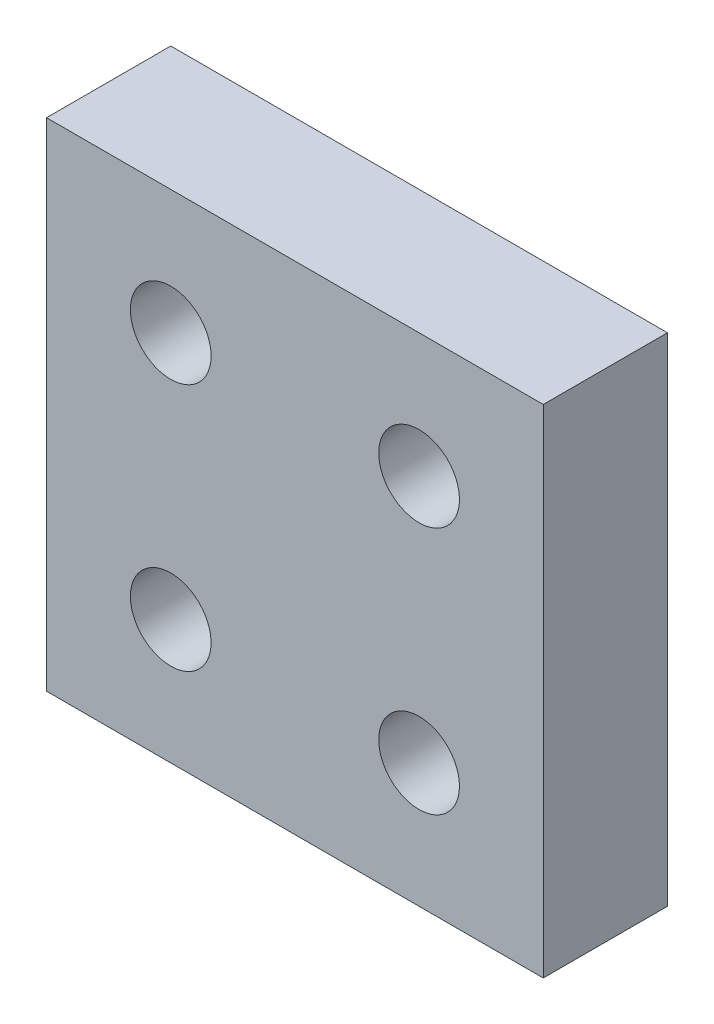
ISO-10303-21;
HEADER;
FILE_DESCRIPTION(('STEP AP214'),'2;1');
FILE_NAME('part.step','',(''),(''),'','','');
FILE_SCHEMA(('AUTOMOTIVE_DESIGN { 1 0 10303 214 1 1 1 1 }'));
ENDSEC;
DATA;
#1=APPLICATION_CONTEXT('core data for automotive mechanical design processes');
#2=APPLICATION_PROTOCOL_DEFINITION('international standard','automotive_design',2000,#1);
#3=PRODUCT_CONTEXT('',#1,'mechanical');
#4=PRODUCT('Part','Part','',(#3));
#5=PRODUCT_RELATED_PRODUCT_CATEGORY('part','',(#4));
#6=PRODUCT_DEFINITION_FORMATION('','',#4);
#7=PRODUCT_DEFINITION_CONTEXT('part definition',#1,'design');
#8=PRODUCT_DEFINITION('design','',#6,#7);
#9=PRODUCT_DEFINITION_SHAPE('','',#8);
#10=(LENGTH_UNIT() NAMED_UNIT(*) SI_UNIT(.MILLI.,.METRE.));
#11=(NAMED_UNIT(*) PLANE_ANGLE_UNIT() SI_UNIT($,.RADIAN.));
#12=(NAMED_UNIT(*) SI_UNIT($,.STERADIAN.) SOLID_ANGLE_UNIT());
#13=UNCERTAINTY_MEASURE_WITH_UNIT(LENGTH_MEASURE(1.E-05),#10,'distance_accuracy_value','');
#14=(GEOMETRIC_REPRESENTATION_CONTEXT(3) GLOBAL_UNCERTAINTY_ASSIGNED_CONTEXT((#13)) GLOBAL_UNIT_ASSIGNED_CONTEXT((#10,
#11,#12)) REPRESENTATION_CONTEXT('',''));
#15=CARTESIAN_POINT('',(0.,0.,0.));
#16=DIRECTION('',(0.,0.,1.));
#17=DIRECTION('',(1.,0.,0.));
#18=AXIS2_PLACEMENT_3D('',#15,#16,#17);
#19=CARTESIAN_POINT('',(0.,0.,5.));
#20=DIRECTION('',(1.,0.,0.));
#21=DIRECTION('',(0.,1.,0.));
#22=AXIS2_PLACEMENT_3D('',#19,#20,#21);
#23=PLANE('',#22);
#24=DIRECTION('',(0.,-1.,0.));
#25=VECTOR('',#24,1.);
#26=CARTESIAN_POINT('',(0.,0.,0.));
#27=LINE('',#26,#25);
#28=CARTESIAN_POINT('',(0.,0.,0.));
#29=VERTEX_POINT('',#28);
#30=CARTESIAN_POINT('',(0.,-20.,0.));
#31=VERTEX_POINT('',#30);
#32=EDGE_CURVE('E111',#29,#31,#27,.T.);
#33=ORIENTED_EDGE('',*,*,#32,.T.);
#34=DIRECTION('',(0.,0.,-1.));
#35=VECTOR('',#34,1.);
#36=CARTESIAN_POINT('',(0.,-20.,5.));
#37=LINE('',#36,#35);
#38=CARTESIAN_POINT('',(0.,-20.,5.));
#39=VERTEX_POINT('',#38);
#40=EDGE_CURVE('E11',#39,#31,#37,.T.);
#41=ORIENTED_EDGE('',*,*,#40,.F.);
#42=DIRECTION('',(0.,-1.,0.));
#43=VECTOR('',#42,1.);
#44=CARTESIAN_POINT('',(0.,0.,5.));
#45=LINE('',#44,#43);
#46=CARTESIAN_POINT('',(0.,0.,5.));
#47=VERTEX_POINT('',#46);
#48=EDGE_CURVE('E95',#47,#39,#45,.T.);
#49=ORIENTED_EDGE('',*,*,#48,.F.);
#50=DIRECTION('',(0.,0.,-1.));
#51=VECTOR('',#50,1.);
#52=CARTESIAN_POINT('',(0.,0.,5.));
#53=LINE('',#52,#51);
#54=EDGE_CURVE('E107',#47,#29,#53,.T.);
#55=ORIENTED_EDGE('',*,*,#54,.T.);
#56=EDGE_LOOP('',(#33,#41,#49,#55));
#57=FACE_BOUND('',#56,.T.);
#58=ADVANCED_FACE('F43',(#57),#23,.F.);
#59=CARTESIAN_POINT('',(0.,-20.,5.));
#60=DIRECTION('',(0.,1.,0.));
#61=DIRECTION('',(0.,0.,1.));
#62=AXIS2_PLACEMENT_3D('',#59,#60,#61);
#63=PLANE('',#62);
#64=DIRECTION('',(1.,0.,0.));
#65=VECTOR('',#64,1.);
#66=CARTESIAN_POINT('',(0.,-20.,0.));
#67=LINE('',#66,#65);
#68=CARTESIAN_POINT('',(20.,-20.,0.));
#69=VERTEX_POINT('',#68);
#70=EDGE_CURVE('E100',#31,#69,#67,.T.);
#71=ORIENTED_EDGE('',*,*,#70,.T.);
#72=DIRECTION('',(0.,0.,-1.));
#73=VECTOR('',#72,1.);
#74=CARTESIAN_POINT('',(20.,-20.,5.));
#75=LINE('',#74,#73);
#76=CARTESIAN_POINT('',(20.,-20.,5.));
#77=VERTEX_POINT('',#76);
#78=EDGE_CURVE('E52',#77,#69,#75,.T.);
#79=ORIENTED_EDGE('',*,*,#78,.F.);
#80=DIRECTION('',(1.,0.,0.));
#81=VECTOR('',#80,1.);
#82=CARTESIAN_POINT('',(0.,-20.,5.));
#83=LINE('',#82,#81);
#84=EDGE_CURVE('E90',#39,#77,#83,.T.);
#85=ORIENTED_EDGE('',*,*,#84,.F.);
#86=ORIENTED_EDGE('',*,*,#40,.T.);
#87=EDGE_LOOP('',(#71,#79,#85,#86));
#88=FACE_BOUND('',#87,.T.);
#89=ADVANCED_FACE('F99',(#88),#63,.F.);
#90=CARTESIAN_POINT('',(20.,0.,5.));
#91=DIRECTION('',(-1.,0.,0.));
#92=DIRECTION('',(0.,-1.,0.));
#93=AXIS2_PLACEMENT_3D('',#90,#91,#92);
#94=PLANE('',#93);
#95=DIRECTION('',(0.,1.,0.));
#96=VECTOR('',#95,1.);
#97=CARTESIAN_POINT('',(20.,0.,0.));
#98=LINE('',#97,#96);
#99=CARTESIAN_POINT('',(20.,0.,0.));
#100=VERTEX_POINT('',#99);
#101=EDGE_CURVE('E77',#69,#100,#98,.T.);
#102=ORIENTED_EDGE('',*,*,#101,.T.);
#103=DIRECTION('',(0.,0.,-1.));
#104=VECTOR('',#103,1.);
#105=CARTESIAN_POINT('',(20.,0.,5.));
#106=LINE('',#105,#104);
#107=CARTESIAN_POINT('',(20.,0.,5.));
#108=VERTEX_POINT('',#107);
#109=EDGE_CURVE('E102',#108,#100,#106,.T.);
#110=ORIENTED_EDGE('',*,*,#109,.F.);
#111=DIRECTION('',(0.,1.,0.));
#112=VECTOR('',#111,1.);
#113=CARTESIAN_POINT('',(20.,0.,5.));
#114=LINE('',#113,#112);
#115=EDGE_CURVE('E93',#77,#108,#114,.T.);
#116=ORIENTED_EDGE('',*,*,#115,.F.);
#117=ORIENTED_EDGE('',*,*,#78,.T.);
#118=EDGE_LOOP('',(#102,#110,#116,#117));
#119=FACE_BOUND('',#118,.T.);
#120=ADVANCED_FACE('F103',(#119),#94,.F.);
#121=CARTESIAN_POINT('',(0.,0.,5.));
#122=DIRECTION('',(0.,-1.,0.));
#123=DIRECTION('',(0.,0.,-1.));
#124=AXIS2_PLACEMENT_3D('',#121,#122,#123);
#125=PLANE('',#124);
#126=DIRECTION('',(-1.,0.,0.));
#127=VECTOR('',#126,1.);
#128=CARTESIAN_POINT('',(0.,0.,0.));
#129=LINE('',#128,#127);
#130=EDGE_CURVE('E83',#100,#29,#129,.T.);
#131=ORIENTED_EDGE('',*,*,#130,.T.);
#132=ORIENTED_EDGE('',*,*,#54,.F.);
#133=DIRECTION('',(-1.,0.,0.));
#134=VECTOR('',#133,1.);
#135=CARTESIAN_POINT('',(0.,0.,5.));
#136=LINE('',#135,#134);
#137=EDGE_CURVE('E60',#108,#47,#136,.T.);
#138=ORIENTED_EDGE('',*,*,#137,.F.);
#139=ORIENTED_EDGE('',*,*,#109,.T.);
#140=EDGE_LOOP('',(#131,#132,#138,#139));
#141=FACE_BOUND('',#140,.T.);
#142=ADVANCED_FACE('F125',(#141),#125,.F.);
#143=CARTESIAN_POINT('',(0.,0.,5.));
#144=DIRECTION('',(0.,0.,1.));
#145=DIRECTION('',(1.,0.,0.));
#146=AXIS2_PLACEMENT_3D('',#143,#144,#145);
#147=PLANE('',#146);
#148=CARTESIAN_POINT('',(5.,-15.,5.));
#149=DIRECTION('',(0.,0.,1.));
#150=DIRECTION('',(-1.,0.,0.));
#151=AXIS2_PLACEMENT_3D('',#148,#149,#150);
#152=CIRCLE('',#151,1.625);
#153=CARTESIAN_POINT('',(3.375,-15.,5.));
#154=VERTEX_POINT('',#153);
#155=EDGE_CURVE('E144',#154,#154,#152,.T.);
#156=ORIENTED_EDGE('',*,*,#155,.F.);
#157=EDGE_LOOP('',(#156));
#158=FACE_BOUND('',#157,.T.);
#159=CARTESIAN_POINT('',(15.,-15.,5.));
#160=DIRECTION('',(0.,0.,1.));
#161=DIRECTION('',(1.,0.,0.));
#162=AXIS2_PLACEMENT_3D('',#159,#160,#161);
#163=CIRCLE('',#162,1.625);
#164=CARTESIAN_POINT('',(16.625,-15.,5.));
#165=VERTEX_POINT('',#164);
#166=EDGE_CURVE('E152',#165,#165,#163,.T.);
#167=ORIENTED_EDGE('',*,*,#166,.F.);
#168=EDGE_LOOP('',(#167));
#169=FACE_BOUND('',#168,.T.);
#170=CARTESIAN_POINT('',(15.,-5.,5.));
#171=DIRECTION('',(0.,0.,1.));
#172=DIRECTION('',(-1.,0.,0.));
#173=AXIS2_PLACEMENT_3D('',#170,#171,#172);
#174=CIRCLE('',#173,1.625);
#175=CARTESIAN_POINT('',(13.375,-5.,5.));
#176=VERTEX_POINT('',#175);
#177=EDGE_CURVE('E136',#176,#176,#174,.T.);
#178=ORIENTED_EDGE('',*,*,#177,.F.);
#179=EDGE_LOOP('',(#178));
#180=FACE_BOUND('',#179,.T.);
#181=CARTESIAN_POINT('',(5.,-5.,5.));
#182=DIRECTION('',(0.,0.,1.));
#183=DIRECTION('',(1.,0.,0.));
#184=AXIS2_PLACEMENT_3D('',#181,#182,#183);
#185=CIRCLE('',#184,1.625);
#186=CARTESIAN_POINT('',(6.625,-5.,5.));
#187=VERTEX_POINT('',#186);
#188=EDGE_CURVE('E132',#187,#187,#185,.T.);
#189=ORIENTED_EDGE('',*,*,#188,.F.);
#190=EDGE_LOOP('',(#189));
#191=FACE_BOUND('',#190,.T.);
#192=ORIENTED_EDGE('',*,*,#48,.T.);
#193=ORIENTED_EDGE('',*,*,#84,.T.);
#194=ORIENTED_EDGE('',*,*,#115,.T.);
#195=ORIENTED_EDGE('',*,*,#137,.T.);
#196=EDGE_LOOP('',(#192,#193,#194,#195));
#197=FACE_BOUND('',#196,.T.);
#198=ADVANCED_FACE('F91',(#158,#169,#180,#191,#197),#147,.T.);
#199=CARTESIAN_POINT('',(0.,0.,0.));
#200=DIRECTION('',(0.,0.,1.));
#201=DIRECTION('',(1.,0.,0.));
#202=AXIS2_PLACEMENT_3D('',#199,#200,#201);
#203=PLANE('',#202);
#204=CARTESIAN_POINT('',(5.,-15.,0.));
#205=DIRECTION('',(0.,0.,1.));
#206=DIRECTION('',(-1.,0.,0.));
#207=AXIS2_PLACEMENT_3D('',#204,#205,#206);
#208=CIRCLE('',#207,1.625);
#209=CARTESIAN_POINT('',(3.375,-15.,0.));
#210=VERTEX_POINT('',#209);
#211=EDGE_CURVE('E140',#210,#210,#208,.T.);
#212=ORIENTED_EDGE('',*,*,#211,.T.);
#213=EDGE_LOOP('',(#212));
#214=FACE_BOUND('',#213,.T.);
#215=CARTESIAN_POINT('',(15.,-15.,0.));
#216=DIRECTION('',(0.,0.,1.));
#217=DIRECTION('',(1.,0.,0.));
#218=AXIS2_PLACEMENT_3D('',#215,#216,#217);
#219=CIRCLE('',#218,1.625);
#220=CARTESIAN_POINT('',(16.625,-15.,0.));
#221=VERTEX_POINT('',#220);
#222=EDGE_CURVE('E148',#221,#221,#219,.T.);
#223=ORIENTED_EDGE('',*,*,#222,.T.);
#224=EDGE_LOOP('',(#223));
#225=FACE_BOUND('',#224,.T.);
#226=CARTESIAN_POINT('',(15.,-5.,0.));
#227=DIRECTION('',(0.,0.,1.));
#228=DIRECTION('',(-1.,0.,0.));
#229=AXIS2_PLACEMENT_3D('',#226,#227,#228);
#230=CIRCLE('',#229,1.625);
#231=CARTESIAN_POINT('',(13.375,-5.,0.));
#232=VERTEX_POINT('',#231);
#233=EDGE_CURVE('E156',#232,#232,#230,.T.);
#234=ORIENTED_EDGE('',*,*,#233,.T.);
#235=EDGE_LOOP('',(#234));
#236=FACE_BOUND('',#235,.T.);
#237=CARTESIAN_POINT('',(5.,-5.,0.));
#238=DIRECTION('',(0.,0.,1.));
#239=DIRECTION('',(1.,0.,0.));
#240=AXIS2_PLACEMENT_3D('',#237,#238,#239);
#241=CIRCLE('',#240,1.625);
#242=CARTESIAN_POINT('',(6.625,-5.,0.));
#243=VERTEX_POINT('',#242);
#244=EDGE_CURVE('E115',#243,#243,#241,.T.);
#245=ORIENTED_EDGE('',*,*,#244,.T.);
#246=EDGE_LOOP('',(#245));
#247=FACE_BOUND('',#246,.T.);
#248=ORIENTED_EDGE('',*,*,#32,.F.);
#249=ORIENTED_EDGE('',*,*,#130,.F.);
#250=ORIENTED_EDGE('',*,*,#101,.F.);
#251=ORIENTED_EDGE('',*,*,#70,.F.);
#252=EDGE_LOOP('',(#248,#249,#250,#251));
#253=FACE_BOUND('',#252,.T.);
#254=ADVANCED_FACE('F128',(#214,#225,#236,#247,#253),#203,.F.);
#255=CARTESIAN_POINT('',(5.,-5.,0.));
#256=DIRECTION('',(0.,0.,1.));
#257=DIRECTION('',(1.,0.,0.));
#258=AXIS2_PLACEMENT_3D('',#255,#256,#257);
#259=CYLINDRICAL_SURFACE('',#258,1.625);
#260=ORIENTED_EDGE('',*,*,#244,.F.);
#261=EDGE_LOOP('',(#260));
#262=FACE_BOUND('',#261,.T.);
#263=ORIENTED_EDGE('',*,*,#188,.T.);
#264=EDGE_LOOP('',(#263));
#265=FACE_BOUND('',#264,.T.);
#266=ADVANCED_FACE('F172',(#262,#265),#259,.F.);
#267=CARTESIAN_POINT('',(15.,-5.,0.));
#268=DIRECTION('',(0.,0.,1.));
#269=DIRECTION('',(1.,0.,0.));
#270=AXIS2_PLACEMENT_3D('',#267,#268,#269);
#271=CYLINDRICAL_SURFACE('',#270,1.625);
#272=ORIENTED_EDGE('',*,*,#233,.F.);
#273=EDGE_LOOP('',(#272));
#274=FACE_BOUND('',#273,.T.);
#275=ORIENTED_EDGE('',*,*,#177,.T.);
#276=EDGE_LOOP('',(#275));
#277=FACE_BOUND('',#276,.T.);
#278=ADVANCED_FACE('F164',(#274,#277),#271,.F.);
#279=CARTESIAN_POINT('',(15.,-15.,0.));
#280=DIRECTION('',(0.,0.,1.));
#281=DIRECTION('',(1.,0.,0.));
#282=AXIS2_PLACEMENT_3D('',#279,#280,#281);
#283=CYLINDRICAL_SURFACE('',#282,1.625);
#284=ORIENTED_EDGE('',*,*,#222,.F.);
#285=EDGE_LOOP('',(#284));
#286=FACE_BOUND('',#285,.T.);
#287=ORIENTED_EDGE('',*,*,#166,.T.);
#288=EDGE_LOOP('',(#287));
#289=FACE_BOUND('',#288,.T.);
#290=ADVANCED_FACE('F180',(#286,#289),#283,.F.);
#291=CARTESIAN_POINT('',(5.,-15.,0.));
#292=DIRECTION('',(0.,0.,1.));
#293=DIRECTION('',(1.,0.,0.));
#294=AXIS2_PLACEMENT_3D('',#291,#292,#293);
#295=CYLINDRICAL_SURFACE('',#294,1.625);
#296=ORIENTED_EDGE('',*,*,#211,.F.);
#297=EDGE_LOOP('',(#296));
#298=FACE_BOUND('',#297,.T.);
#299=ORIENTED_EDGE('',*,*,#155,.T.);
#300=EDGE_LOOP('',(#299));
#301=FACE_BOUND('',#300,.T.);
#302=ADVANCED_FACE('F231',(#298,#301),#295,.F.);
#303=CLOSED_SHELL('',(#58,#89,#120,#142,#198,#254,#266,#278,#290,#302));
#304=MANIFOLD_SOLID_BREP('B2',#303);
#305=ADVANCED_BREP_SHAPE_REPRESENTATION('',(#18,#304),#14);
#306=SHAPE_DEFINITION_REPRESENTATION(#9,#305);
ENDSEC;
END-ISO-10303-21;
